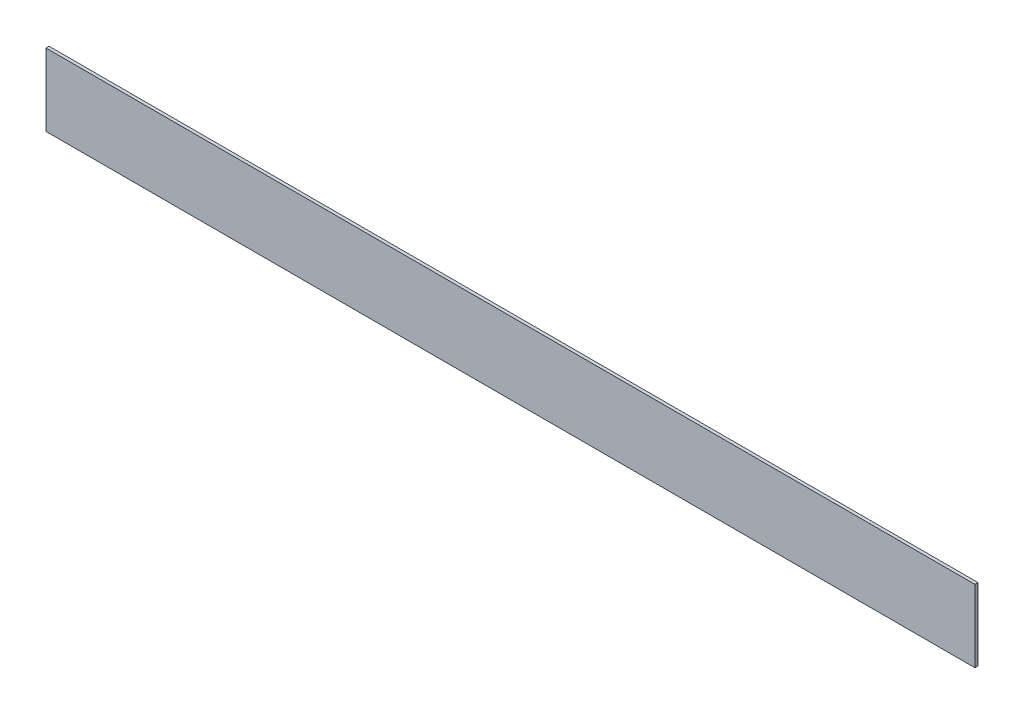
ISO-10303-21;
HEADER;
FILE_DESCRIPTION(('STEP AP214'),'2;1');
FILE_NAME('part.step','',(''),(''),'','','');
FILE_SCHEMA(('AUTOMOTIVE_DESIGN { 1 0 10303 214 1 1 1 1 }'));
ENDSEC;
DATA;
#1=APPLICATION_CONTEXT('core data for automotive mechanical design processes');
#2=APPLICATION_PROTOCOL_DEFINITION('international standard','automotive_design',2000,#1);
#3=PRODUCT_CONTEXT('',#1,'mechanical');
#4=PRODUCT('Part','Part','',(#3));
#5=PRODUCT_RELATED_PRODUCT_CATEGORY('part','',(#4));
#6=PRODUCT_DEFINITION_FORMATION('','',#4);
#7=PRODUCT_DEFINITION_CONTEXT('part definition',#1,'design');
#8=PRODUCT_DEFINITION('design','',#6,#7);
#9=PRODUCT_DEFINITION_SHAPE('','',#8);
#10=(LENGTH_UNIT() NAMED_UNIT(*) SI_UNIT(.MILLI.,.METRE.));
#11=(NAMED_UNIT(*) PLANE_ANGLE_UNIT() SI_UNIT($,.RADIAN.));
#12=(NAMED_UNIT(*) SI_UNIT($,.STERADIAN.) SOLID_ANGLE_UNIT());
#13=UNCERTAINTY_MEASURE_WITH_UNIT(LENGTH_MEASURE(1.E-05),#10,'distance_accuracy_value','');
#14=(GEOMETRIC_REPRESENTATION_CONTEXT(3) GLOBAL_UNCERTAINTY_ASSIGNED_CONTEXT((#13)) GLOBAL_UNIT_ASSIGNED_CONTEXT((#10,
#11,#12)) REPRESENTATION_CONTEXT('',''));
#15=CARTESIAN_POINT('',(0.,0.,0.));
#16=DIRECTION('',(0.,0.,1.));
#17=DIRECTION('',(1.,0.,0.));
#18=AXIS2_PLACEMENT_3D('',#15,#16,#17);
#19=CARTESIAN_POINT('',(-202.953890489914,33.3933717579251,1.5));
#20=DIRECTION('',(1.,0.,0.));
#21=DIRECTION('',(0.,0.,-1.));
#22=AXIS2_PLACEMENT_3D('',#19,#20,#21);
#23=PLANE('',#22);
#24=DIRECTION('',(0.,-1.,0.));
#25=VECTOR('',#24,1.);
#26=CARTESIAN_POINT('',(-202.953890489914,33.3933717579251,0.));
#27=LINE('',#26,#25);
#28=CARTESIAN_POINT('',(-202.953890489914,33.3933717579251,0.));
#29=VERTEX_POINT('',#28);
#30=CARTESIAN_POINT('',(-202.953890489914,-1.60662824207492,0.));
#31=VERTEX_POINT('',#30);
#32=EDGE_CURVE('E98',#29,#31,#27,.T.);
#33=ORIENTED_EDGE('',*,*,#32,.T.);
#34=DIRECTION('',(0.,0.,-1.));
#35=VECTOR('',#34,1.);
#36=CARTESIAN_POINT('',(-202.953890489914,-1.60662824207492,1.5));
#37=LINE('',#36,#35);
#38=CARTESIAN_POINT('',(-202.953890489914,-1.60662824207492,1.5));
#39=VERTEX_POINT('',#38);
#40=EDGE_CURVE('E11',#39,#31,#37,.T.);
#41=ORIENTED_EDGE('',*,*,#40,.F.);
#42=DIRECTION('',(0.,-1.,0.));
#43=VECTOR('',#42,1.);
#44=CARTESIAN_POINT('',(-202.953890489914,33.3933717579251,1.5));
#45=LINE('',#44,#43);
#46=CARTESIAN_POINT('',(-202.953890489914,33.3933717579251,1.5));
#47=VERTEX_POINT('',#46);
#48=EDGE_CURVE('E86',#47,#39,#45,.T.);
#49=ORIENTED_EDGE('',*,*,#48,.F.);
#50=DIRECTION('',(0.,0.,-1.));
#51=VECTOR('',#50,1.);
#52=CARTESIAN_POINT('',(-202.953890489914,33.3933717579251,1.5));
#53=LINE('',#52,#51);
#54=EDGE_CURVE('E94',#47,#29,#53,.T.);
#55=ORIENTED_EDGE('',*,*,#54,.T.);
#56=EDGE_LOOP('',(#33,#41,#49,#55));
#57=FACE_BOUND('',#56,.T.);
#58=ADVANCED_FACE('F35',(#57),#23,.F.);
#59=CARTESIAN_POINT('',(-202.953890489914,-1.60662824207492,1.5));
#60=DIRECTION('',(0.,1.,0.));
#61=DIRECTION('',(0.,0.,1.));
#62=AXIS2_PLACEMENT_3D('',#59,#60,#61);
#63=PLANE('',#62);
#64=DIRECTION('',(1.,0.,0.));
#65=VECTOR('',#64,1.);
#66=CARTESIAN_POINT('',(-202.953890489914,-1.60662824207492,0.));
#67=LINE('',#66,#65);
#68=CARTESIAN_POINT('',(247.046109510086,-1.60662824207492,0.));
#69=VERTEX_POINT('',#68);
#70=EDGE_CURVE('E90',#31,#69,#67,.T.);
#71=ORIENTED_EDGE('',*,*,#70,.T.);
#72=DIRECTION('',(0.,0.,-1.));
#73=VECTOR('',#72,1.);
#74=CARTESIAN_POINT('',(247.046109510086,-1.60662824207492,1.5));
#75=LINE('',#74,#73);
#76=CARTESIAN_POINT('',(247.046109510086,-1.60662824207492,1.5));
#77=VERTEX_POINT('',#76);
#78=EDGE_CURVE('E43',#77,#69,#75,.T.);
#79=ORIENTED_EDGE('',*,*,#78,.F.);
#80=DIRECTION('',(1.,0.,0.));
#81=VECTOR('',#80,1.);
#82=CARTESIAN_POINT('',(-202.953890489914,-1.60662824207492,1.5));
#83=LINE('',#82,#81);
#84=EDGE_CURVE('E81',#39,#77,#83,.T.);
#85=ORIENTED_EDGE('',*,*,#84,.F.);
#86=ORIENTED_EDGE('',*,*,#40,.T.);
#87=EDGE_LOOP('',(#71,#79,#85,#86));
#88=FACE_BOUND('',#87,.T.);
#89=ADVANCED_FACE('F89',(#88),#63,.F.);
#90=CARTESIAN_POINT('',(247.046109510086,33.3933717579251,1.5));
#91=DIRECTION('',(-1.,0.,0.));
#92=DIRECTION('',(0.,-1.,0.));
#93=AXIS2_PLACEMENT_3D('',#90,#91,#92);
#94=PLANE('',#93);
#95=DIRECTION('',(0.,1.,0.));
#96=VECTOR('',#95,1.);
#97=CARTESIAN_POINT('',(247.046109510086,33.3933717579251,0.));
#98=LINE('',#97,#96);
#99=CARTESIAN_POINT('',(247.046109510086,33.3933717579251,0.));
#100=VERTEX_POINT('',#99);
#101=EDGE_CURVE('E68',#69,#100,#98,.T.);
#102=ORIENTED_EDGE('',*,*,#101,.T.);
#103=DIRECTION('',(0.,0.,-1.));
#104=VECTOR('',#103,1.);
#105=CARTESIAN_POINT('',(247.046109510086,33.3933717579251,1.5));
#106=LINE('',#105,#104);
#107=CARTESIAN_POINT('',(247.046109510086,33.3933717579251,1.5));
#108=VERTEX_POINT('',#107);
#109=EDGE_CURVE('E91',#108,#100,#106,.T.);
#110=ORIENTED_EDGE('',*,*,#109,.F.);
#111=DIRECTION('',(0.,1.,0.));
#112=VECTOR('',#111,1.);
#113=CARTESIAN_POINT('',(247.046109510086,33.3933717579251,1.5));
#114=LINE('',#113,#112);
#115=EDGE_CURVE('E84',#77,#108,#114,.T.);
#116=ORIENTED_EDGE('',*,*,#115,.F.);
#117=ORIENTED_EDGE('',*,*,#78,.T.);
#118=EDGE_LOOP('',(#102,#110,#116,#117));
#119=FACE_BOUND('',#118,.T.);
#120=ADVANCED_FACE('F92',(#119),#94,.F.);
#121=CARTESIAN_POINT('',(-202.953890489914,33.3933717579251,1.5));
#122=DIRECTION('',(0.,-1.,0.));
#123=DIRECTION('',(0.,0.,-1.));
#124=AXIS2_PLACEMENT_3D('',#121,#122,#123);
#125=PLANE('',#124);
#126=DIRECTION('',(-1.,0.,0.));
#127=VECTOR('',#126,1.);
#128=CARTESIAN_POINT('',(-202.953890489914,33.3933717579251,0.));
#129=LINE('',#128,#127);
#130=EDGE_CURVE('E74',#100,#29,#129,.T.);
#131=ORIENTED_EDGE('',*,*,#130,.T.);
#132=ORIENTED_EDGE('',*,*,#54,.F.);
#133=DIRECTION('',(-1.,0.,0.));
#134=VECTOR('',#133,1.);
#135=CARTESIAN_POINT('',(-202.953890489914,33.3933717579251,1.5));
#136=LINE('',#135,#134);
#137=EDGE_CURVE('E51',#108,#47,#136,.T.);
#138=ORIENTED_EDGE('',*,*,#137,.F.);
#139=ORIENTED_EDGE('',*,*,#109,.T.);
#140=EDGE_LOOP('',(#131,#132,#138,#139));
#141=FACE_BOUND('',#140,.T.);
#142=ADVANCED_FACE('F105',(#141),#125,.F.);
#143=CARTESIAN_POINT('',(0.,0.,1.5));
#144=DIRECTION('',(0.,0.,1.));
#145=DIRECTION('',(1.,0.,0.));
#146=AXIS2_PLACEMENT_3D('',#143,#144,#145);
#147=PLANE('',#146);
#148=ORIENTED_EDGE('',*,*,#48,.T.);
#149=ORIENTED_EDGE('',*,*,#84,.T.);
#150=ORIENTED_EDGE('',*,*,#115,.T.);
#151=ORIENTED_EDGE('',*,*,#137,.T.);
#152=EDGE_LOOP('',(#148,#149,#150,#151));
#153=FACE_BOUND('',#152,.T.);
#154=ADVANCED_FACE('F82',(#153),#147,.T.);
#155=CARTESIAN_POINT('',(0.,0.,0.));
#156=DIRECTION('',(0.,0.,1.));
#157=DIRECTION('',(1.,0.,0.));
#158=AXIS2_PLACEMENT_3D('',#155,#156,#157);
#159=PLANE('',#158);
#160=ORIENTED_EDGE('',*,*,#32,.F.);
#161=ORIENTED_EDGE('',*,*,#130,.F.);
#162=ORIENTED_EDGE('',*,*,#101,.F.);
#163=ORIENTED_EDGE('',*,*,#70,.F.);
#164=EDGE_LOOP('',(#160,#161,#162,#163));
#165=FACE_BOUND('',#164,.T.);
#166=ADVANCED_FACE('F108',(#165),#159,.F.);
#167=CLOSED_SHELL('',(#58,#89,#120,#142,#154,#166));
#168=MANIFOLD_SOLID_BREP('B2',#167);
#169=ADVANCED_BREP_SHAPE_REPRESENTATION('',(#18,#168),#14);
#170=SHAPE_DEFINITION_REPRESENTATION(#9,#169);
ENDSEC;
END-ISO-10303-21;
